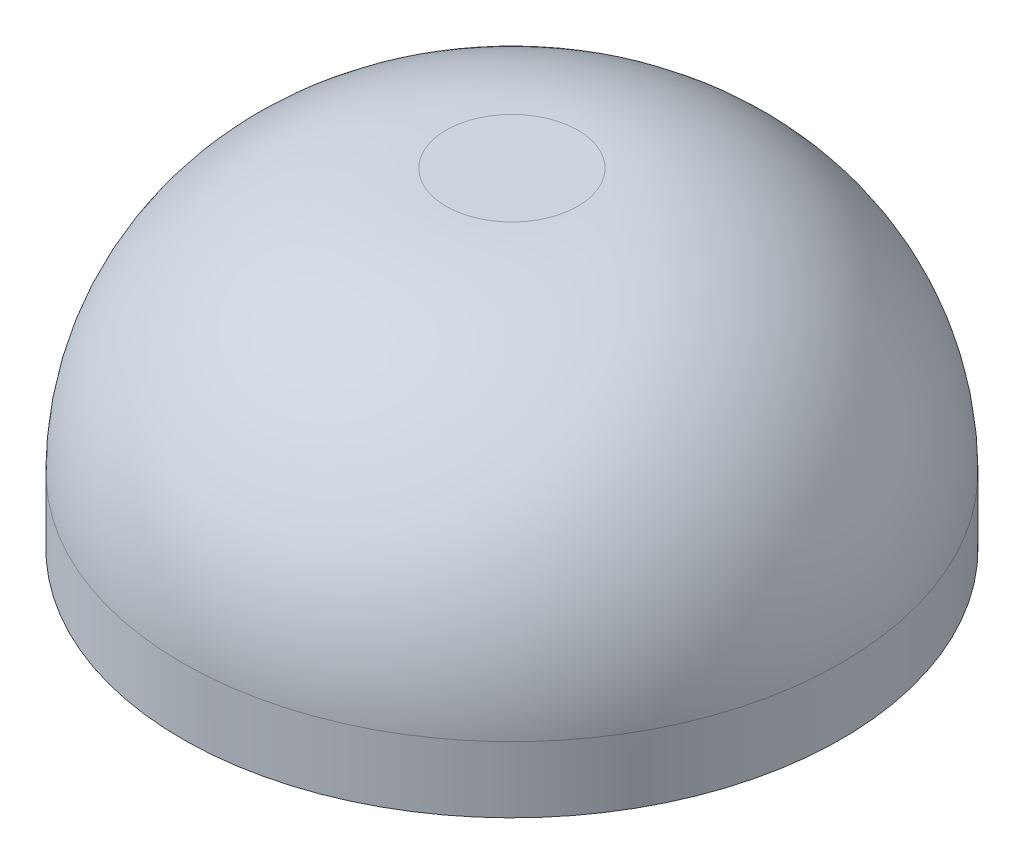
ISO-10303-21;
HEADER;
FILE_DESCRIPTION(('STEP AP214'),'2;1');
FILE_NAME('part.step','',(''),(''),'','','');
FILE_SCHEMA(('AUTOMOTIVE_DESIGN { 1 0 10303 214 1 1 1 1 }'));
ENDSEC;
DATA;
#1=APPLICATION_CONTEXT('core data for automotive mechanical design processes');
#2=APPLICATION_PROTOCOL_DEFINITION('international standard','automotive_design',2000,#1);
#3=PRODUCT_CONTEXT('',#1,'mechanical');
#4=PRODUCT('Part','Part','',(#3));
#5=PRODUCT_RELATED_PRODUCT_CATEGORY('part','',(#4));
#6=PRODUCT_DEFINITION_FORMATION('','',#4);
#7=PRODUCT_DEFINITION_CONTEXT('part definition',#1,'design');
#8=PRODUCT_DEFINITION('design','',#6,#7);
#9=PRODUCT_DEFINITION_SHAPE('','',#8);
#10=(LENGTH_UNIT() NAMED_UNIT(*) SI_UNIT(.MILLI.,.METRE.));
#11=(NAMED_UNIT(*) PLANE_ANGLE_UNIT() SI_UNIT($,.RADIAN.));
#12=(NAMED_UNIT(*) SI_UNIT($,.STERADIAN.) SOLID_ANGLE_UNIT());
#13=UNCERTAINTY_MEASURE_WITH_UNIT(LENGTH_MEASURE(1.E-05),#10,'distance_accuracy_value','');
#14=(GEOMETRIC_REPRESENTATION_CONTEXT(3) GLOBAL_UNCERTAINTY_ASSIGNED_CONTEXT((#13)) GLOBAL_UNIT_ASSIGNED_CONTEXT((#10,
#11,#12)) REPRESENTATION_CONTEXT('',''));
#15=CARTESIAN_POINT('',(0.,0.,0.));
#16=DIRECTION('',(0.,0.,1.));
#17=DIRECTION('',(1.,0.,0.));
#18=AXIS2_PLACEMENT_3D('',#15,#16,#17);
#19=CARTESIAN_POINT('',(-46.2541002310008,3.81,16.993426234333));
#20=DIRECTION('',(0.,1.,0.));
#21=DIRECTION('',(1.,0.,0.));
#22=AXIS2_PLACEMENT_3D('',#19,#20,#21);
#23=PLANE('',#22);
#24=CARTESIAN_POINT('',(-38.4829242915095,3.81,-28.9438382197023));
#25=DIRECTION('',(0.,-1.,0.));
#26=DIRECTION('',(-1.,0.,0.));
#27=AXIS2_PLACEMENT_3D('',#24,#25,#26);
#28=CIRCLE('',#27,6.35);
#29=CARTESIAN_POINT('',(-44.8329242915095,3.81,-28.9438382197023));
#30=VERTEX_POINT('',#29);
#31=EDGE_CURVE('E10',#30,#30,#28,.F.);
#32=ORIENTED_EDGE('',*,*,#31,.F.);
#33=EDGE_LOOP('',(#32));
#34=FACE_BOUND('',#33,.T.);
#35=ADVANCED_FACE('F34',(#34),#23,.F.);
#36=CARTESIAN_POINT('',(-38.4829242915095,10.16,-28.9438382197023));
#37=DIRECTION('',(0.,-1.,0.));
#38=DIRECTION('',(-1.,0.,0.));
#39=AXIS2_PLACEMENT_3D('',#36,#37,#38);
#40=CYLINDRICAL_SURFACE('',#39,6.35);
#41=CARTESIAN_POINT('',(-38.4829242915095,5.08,-28.9438382197023));
#42=DIRECTION('',(0.,1.,0.));
#43=DIRECTION('',(1.,0.,0.));
#44=AXIS2_PLACEMENT_3D('',#41,#42,#43);
#45=CIRCLE('',#44,6.35);
#46=CARTESIAN_POINT('',(-32.1329242915095,5.08,-28.9438382197023));
#47=VERTEX_POINT('',#46);
#48=EDGE_CURVE('E44',#47,#47,#45,.F.);
#49=ORIENTED_EDGE('',*,*,#48,.T.);
#50=EDGE_LOOP('',(#49));
#51=FACE_BOUND('',#50,.T.);
#52=ORIENTED_EDGE('',*,*,#31,.T.);
#53=EDGE_LOOP('',(#52));
#54=FACE_BOUND('',#53,.T.);
#55=ADVANCED_FACE('F51',(#51,#54),#40,.T.);
#56=CARTESIAN_POINT('',(-38.4829242915095,10.16,-28.9438382197023));
#57=DIRECTION('',(0.,1.,0.));
#58=DIRECTION('',(1.,0.,0.));
#59=AXIS2_PLACEMENT_3D('',#56,#57,#58);
#60=PLANE('',#59);
#61=CARTESIAN_POINT('',(-38.4829242915095,10.16,-28.9438382197023));
#62=DIRECTION('',(0.,1.,0.));
#63=DIRECTION('',(1.,0.,0.));
#64=AXIS2_PLACEMENT_3D('',#61,#62,#63);
#65=CIRCLE('',#64,1.27);
#66=CARTESIAN_POINT('',(-37.2129242915095,10.16,-28.9438382197023));
#67=VERTEX_POINT('',#66);
#68=EDGE_CURVE('E40',#67,#67,#65,.T.);
#69=ORIENTED_EDGE('',*,*,#68,.T.);
#70=EDGE_LOOP('',(#69));
#71=FACE_BOUND('',#70,.T.);
#72=ADVANCED_FACE('F56',(#71),#60,.T.);
#73=CARTESIAN_POINT('',(-38.4829242915095,5.08,-28.9438382197023));
#74=DIRECTION('',(0.,1.,0.));
#75=DIRECTION('',(1.,0.,0.));
#76=AXIS2_PLACEMENT_3D('',#73,#74,#75);
#77=DEGENERATE_TOROIDAL_SURFACE('',#76,1.27,5.08,.T.);
#78=ORIENTED_EDGE('',*,*,#48,.F.);
#79=EDGE_LOOP('',(#78));
#80=FACE_BOUND('',#79,.T.);
#81=ORIENTED_EDGE('',*,*,#68,.F.);
#82=EDGE_LOOP('',(#81));
#83=FACE_BOUND('',#82,.T.);
#84=ADVANCED_FACE('F53',(#80,#83),#77,.T.);
#85=CLOSED_SHELL('',(#35,#55,#72,#84));
#86=MANIFOLD_SOLID_BREP('B2',#85);
#87=ADVANCED_BREP_SHAPE_REPRESENTATION('',(#18,#86),#14);
#88=SHAPE_DEFINITION_REPRESENTATION(#9,#87);
ENDSEC;
END-ISO-10303-21;
